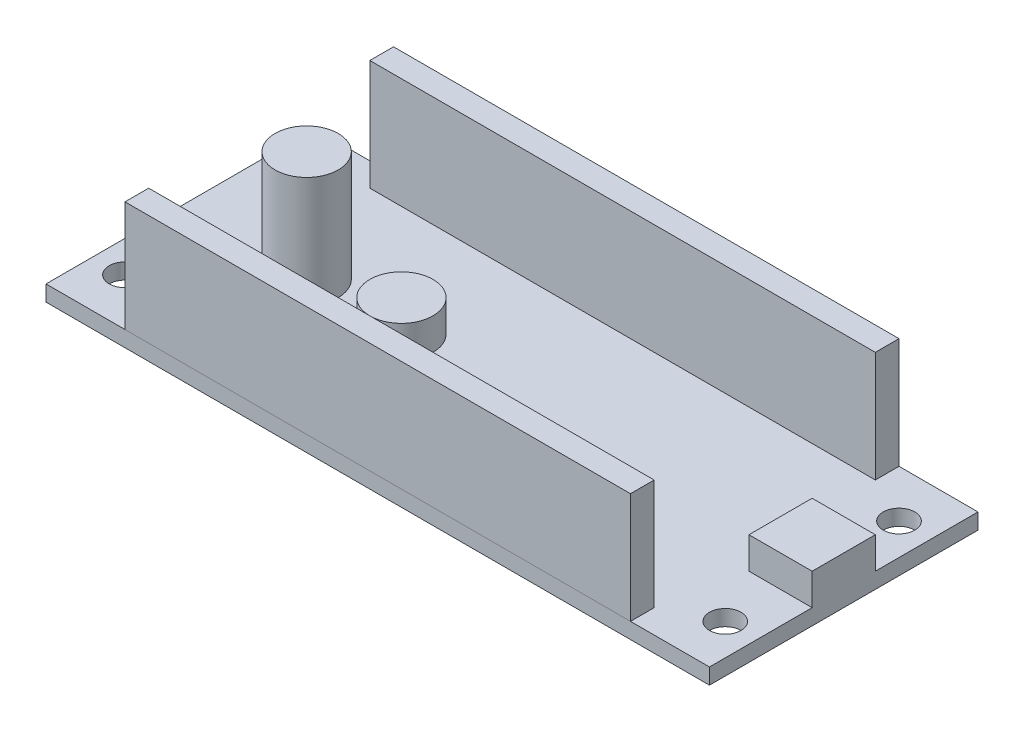
ISO-10303-21;
HEADER;
FILE_DESCRIPTION(('STEP AP214'),'2;1');
FILE_NAME('part.step','',(''),(''),'','','');
FILE_SCHEMA(('AUTOMOTIVE_DESIGN { 1 0 10303 214 1 1 1 1 }'));
ENDSEC;
DATA;
#1=APPLICATION_CONTEXT('core data for automotive mechanical design processes');
#2=APPLICATION_PROTOCOL_DEFINITION('international standard','automotive_design',2000,#1);
#3=PRODUCT_CONTEXT('',#1,'mechanical');
#4=PRODUCT('Part','Part','',(#3));
#5=PRODUCT_RELATED_PRODUCT_CATEGORY('part','',(#4));
#6=PRODUCT_DEFINITION_FORMATION('','',#4);
#7=PRODUCT_DEFINITION_CONTEXT('part definition',#1,'design');
#8=PRODUCT_DEFINITION('design','',#6,#7);
#9=PRODUCT_DEFINITION_SHAPE('','',#8);
#10=(LENGTH_UNIT() NAMED_UNIT(*) SI_UNIT(.MILLI.,.METRE.));
#11=(NAMED_UNIT(*) PLANE_ANGLE_UNIT() SI_UNIT($,.RADIAN.));
#12=(NAMED_UNIT(*) SI_UNIT($,.STERADIAN.) SOLID_ANGLE_UNIT());
#13=UNCERTAINTY_MEASURE_WITH_UNIT(LENGTH_MEASURE(1.E-05),#10,'distance_accuracy_value','');
#14=(GEOMETRIC_REPRESENTATION_CONTEXT(3) GLOBAL_UNCERTAINTY_ASSIGNED_CONTEXT((#13)) GLOBAL_UNIT_ASSIGNED_CONTEXT((#10,
#11,#12)) REPRESENTATION_CONTEXT('',''));
#15=CARTESIAN_POINT('',(0.,0.,0.));
#16=DIRECTION('',(0.,0.,1.));
#17=DIRECTION('',(1.,0.,0.));
#18=AXIS2_PLACEMENT_3D('',#15,#16,#17);
#19=CARTESIAN_POINT('',(-20.6375,12.7,0.));
#20=DIRECTION('',(0.,-1.,0.));
#21=DIRECTION('',(0.,0.,-1.));
#22=AXIS2_PLACEMENT_3D('',#19,#20,#21);
#23=CYLINDRICAL_SURFACE('',#22,3.175);
#24=CARTESIAN_POINT('',(-20.6375,12.7,0.));
#25=DIRECTION('',(0.,1.,0.));
#26=DIRECTION('',(0.,0.,1.));
#27=AXIS2_PLACEMENT_3D('',#24,#25,#26);
#28=CIRCLE('',#27,3.175);
#29=CARTESIAN_POINT('',(-20.6375,12.7,3.175));
#30=VERTEX_POINT('',#29);
#31=EDGE_CURVE('E11',#30,#30,#28,.T.);
#32=ORIENTED_EDGE('',*,*,#31,.F.);
#33=EDGE_LOOP('',(#32));
#34=FACE_BOUND('',#33,.T.);
#35=CARTESIAN_POINT('',(-20.6375,1.5875,0.));
#36=DIRECTION('',(0.,1.,0.));
#37=DIRECTION('',(0.,0.,1.));
#38=AXIS2_PLACEMENT_3D('',#35,#36,#37);
#39=CIRCLE('',#38,3.175);
#40=CARTESIAN_POINT('',(-20.6375,1.5875,3.175));
#41=VERTEX_POINT('',#40);
#42=EDGE_CURVE('E46',#41,#41,#39,.T.);
#43=ORIENTED_EDGE('',*,*,#42,.T.);
#44=EDGE_LOOP('',(#43));
#45=FACE_BOUND('',#44,.T.);
#46=ADVANCED_FACE('F43',(#34,#45),#23,.T.);
#47=CARTESIAN_POINT('',(-20.6375,12.7,0.));
#48=DIRECTION('',(0.,1.,0.));
#49=DIRECTION('',(0.,0.,1.));
#50=AXIS2_PLACEMENT_3D('',#47,#48,#49);
#51=PLANE('',#50);
#52=ORIENTED_EDGE('',*,*,#31,.T.);
#53=EDGE_LOOP('',(#52));
#54=FACE_BOUND('',#53,.T.);
#55=ADVANCED_FACE('F58',(#54),#51,.T.);
#56=CARTESIAN_POINT('',(-20.6375,1.5875,0.));
#57=DIRECTION('',(0.,1.,0.));
#58=DIRECTION('',(0.,0.,1.));
#59=AXIS2_PLACEMENT_3D('',#56,#57,#58);
#60=PLANE('',#59);
#61=ORIENTED_EDGE('',*,*,#42,.F.);
#62=EDGE_LOOP('',(#61));
#63=FACE_BOUND('',#62,.T.);
#64=ADVANCED_FACE('F56',(#63),#60,.F.);
#65=CLOSED_SHELL('',(#46,#55,#64));
#66=MANIFOLD_SOLID_BREP('B2',#65);
#67=CARTESIAN_POINT('',(-25.4,12.7,13.49375));
#68=DIRECTION('',(1.,0.,0.));
#69=DIRECTION('',(0.,0.,-1.));
#70=AXIS2_PLACEMENT_3D('',#67,#68,#69);
#71=PLANE('',#70);
#72=DIRECTION('',(0.,0.,1.));
#73=VECTOR('',#72,1.);
#74=CARTESIAN_POINT('',(-25.4,1.5875,13.49375));
#75=LINE('',#74,#73);
#76=CARTESIAN_POINT('',(-25.4,1.5875,11.1125));
#77=VERTEX_POINT('',#76);
#78=CARTESIAN_POINT('',(-25.4,1.5875,13.49375));
#79=VERTEX_POINT('',#78);
#80=EDGE_CURVE('E156',#77,#79,#75,.T.);
#81=ORIENTED_EDGE('',*,*,#80,.T.);
#82=DIRECTION('',(0.,-1.,0.));
#83=VECTOR('',#82,1.);
#84=CARTESIAN_POINT('',(-25.4,12.7,13.49375));
#85=LINE('',#84,#83);
#86=CARTESIAN_POINT('',(-25.4,12.7,13.49375));
#87=VERTEX_POINT('',#86);
#88=EDGE_CURVE('E41',#87,#79,#85,.T.);
#89=ORIENTED_EDGE('',*,*,#88,.F.);
#90=DIRECTION('',(0.,0.,1.));
#91=VECTOR('',#90,1.);
#92=CARTESIAN_POINT('',(-25.4,12.7,13.49375));
#93=LINE('',#92,#91);
#94=CARTESIAN_POINT('',(-25.4,12.7,11.1125));
#95=VERTEX_POINT('',#94);
#96=EDGE_CURVE('E144',#95,#87,#93,.T.);
#97=ORIENTED_EDGE('',*,*,#96,.F.);
#98=DIRECTION('',(0.,-1.,0.));
#99=VECTOR('',#98,1.);
#100=CARTESIAN_POINT('',(-25.4,12.7,11.1125));
#101=LINE('',#100,#99);
#102=EDGE_CURVE('E152',#95,#77,#101,.T.);
#103=ORIENTED_EDGE('',*,*,#102,.T.);
#104=EDGE_LOOP('',(#81,#89,#97,#103));
#105=FACE_BOUND('',#104,.T.);
#106=ADVANCED_FACE('F93',(#105),#71,.F.);
#107=CARTESIAN_POINT('',(-25.4,12.7,13.49375));
#108=DIRECTION('',(0.,0.,-1.));
#109=DIRECTION('',(-1.,0.,0.));
#110=AXIS2_PLACEMENT_3D('',#107,#108,#109);
#111=PLANE('',#110);
#112=DIRECTION('',(1.,0.,0.));
#113=VECTOR('',#112,1.);
#114=CARTESIAN_POINT('',(-25.4,1.5875,13.49375));
#115=LINE('',#114,#113);
#116=CARTESIAN_POINT('',(25.4,1.5875,13.49375));
#117=VERTEX_POINT('',#116);
#118=EDGE_CURVE('E148',#79,#117,#115,.T.);
#119=ORIENTED_EDGE('',*,*,#118,.T.);
#120=DIRECTION('',(0.,-1.,0.));
#121=VECTOR('',#120,1.);
#122=CARTESIAN_POINT('',(25.4,12.7,13.49375));
#123=LINE('',#122,#121);
#124=CARTESIAN_POINT('',(25.4,12.7,13.49375));
#125=VERTEX_POINT('',#124);
#126=EDGE_CURVE('E101',#125,#117,#123,.T.);
#127=ORIENTED_EDGE('',*,*,#126,.F.);
#128=DIRECTION('',(1.,0.,0.));
#129=VECTOR('',#128,1.);
#130=CARTESIAN_POINT('',(-25.4,12.7,13.49375));
#131=LINE('',#130,#129);
#132=EDGE_CURVE('E139',#87,#125,#131,.T.);
#133=ORIENTED_EDGE('',*,*,#132,.F.);
#134=ORIENTED_EDGE('',*,*,#88,.T.);
#135=EDGE_LOOP('',(#119,#127,#133,#134));
#136=FACE_BOUND('',#135,.T.);
#137=ADVANCED_FACE('F147',(#136),#111,.F.);
#138=CARTESIAN_POINT('',(25.4,12.7,13.49375));
#139=DIRECTION('',(-1.,0.,0.));
#140=DIRECTION('',(0.,0.,1.));
#141=AXIS2_PLACEMENT_3D('',#138,#139,#140);
#142=PLANE('',#141);
#143=DIRECTION('',(0.,0.,-1.));
#144=VECTOR('',#143,1.);
#145=CARTESIAN_POINT('',(25.4,1.5875,13.49375));
#146=LINE('',#145,#144);
#147=CARTESIAN_POINT('',(25.4,1.5875,11.1125));
#148=VERTEX_POINT('',#147);
#149=EDGE_CURVE('E126',#117,#148,#146,.T.);
#150=ORIENTED_EDGE('',*,*,#149,.T.);
#151=DIRECTION('',(0.,-1.,0.));
#152=VECTOR('',#151,1.);
#153=CARTESIAN_POINT('',(25.4,12.7,11.1125));
#154=LINE('',#153,#152);
#155=CARTESIAN_POINT('',(25.4,12.7,11.1125));
#156=VERTEX_POINT('',#155);
#157=EDGE_CURVE('E149',#156,#148,#154,.T.);
#158=ORIENTED_EDGE('',*,*,#157,.F.);
#159=DIRECTION('',(0.,0.,-1.));
#160=VECTOR('',#159,1.);
#161=CARTESIAN_POINT('',(25.4,12.7,13.49375));
#162=LINE('',#161,#160);
#163=EDGE_CURVE('E142',#125,#156,#162,.T.);
#164=ORIENTED_EDGE('',*,*,#163,.F.);
#165=ORIENTED_EDGE('',*,*,#126,.T.);
#166=EDGE_LOOP('',(#150,#158,#164,#165));
#167=FACE_BOUND('',#166,.T.);
#168=ADVANCED_FACE('F150',(#167),#142,.F.);
#169=CARTESIAN_POINT('',(-25.4,12.7,11.1125));
#170=DIRECTION('',(0.,0.,1.));
#171=DIRECTION('',(1.,0.,0.));
#172=AXIS2_PLACEMENT_3D('',#169,#170,#171);
#173=PLANE('',#172);
#174=DIRECTION('',(-1.,0.,0.));
#175=VECTOR('',#174,1.);
#176=CARTESIAN_POINT('',(-25.4,1.5875,11.1125));
#177=LINE('',#176,#175);
#178=EDGE_CURVE('E132',#148,#77,#177,.T.);
#179=ORIENTED_EDGE('',*,*,#178,.T.);
#180=ORIENTED_EDGE('',*,*,#102,.F.);
#181=DIRECTION('',(-1.,0.,0.));
#182=VECTOR('',#181,1.);
#183=CARTESIAN_POINT('',(-25.4,12.7,11.1125));
#184=LINE('',#183,#182);
#185=EDGE_CURVE('E109',#156,#95,#184,.T.);
#186=ORIENTED_EDGE('',*,*,#185,.F.);
#187=ORIENTED_EDGE('',*,*,#157,.T.);
#188=EDGE_LOOP('',(#179,#180,#186,#187));
#189=FACE_BOUND('',#188,.T.);
#190=ADVANCED_FACE('F163',(#189),#173,.F.);
#191=CARTESIAN_POINT('',(0.,12.7,0.));
#192=DIRECTION('',(0.,-1.,0.));
#193=DIRECTION('',(0.,0.,-1.));
#194=AXIS2_PLACEMENT_3D('',#191,#192,#193);
#195=PLANE('',#194);
#196=ORIENTED_EDGE('',*,*,#96,.T.);
#197=ORIENTED_EDGE('',*,*,#132,.T.);
#198=ORIENTED_EDGE('',*,*,#163,.T.);
#199=ORIENTED_EDGE('',*,*,#185,.T.);
#200=EDGE_LOOP('',(#196,#197,#198,#199));
#201=FACE_BOUND('',#200,.T.);
#202=ADVANCED_FACE('F140',(#201),#195,.F.);
#203=CARTESIAN_POINT('',(0.,1.5875,0.));
#204=DIRECTION('',(0.,-1.,0.));
#205=DIRECTION('',(0.,0.,-1.));
#206=AXIS2_PLACEMENT_3D('',#203,#204,#205);
#207=PLANE('',#206);
#208=ORIENTED_EDGE('',*,*,#80,.F.);
#209=ORIENTED_EDGE('',*,*,#178,.F.);
#210=ORIENTED_EDGE('',*,*,#149,.F.);
#211=ORIENTED_EDGE('',*,*,#118,.F.);
#212=EDGE_LOOP('',(#208,#209,#210,#211));
#213=FACE_BOUND('',#212,.T.);
#214=ADVANCED_FACE('F166',(#213),#207,.T.);
#215=CLOSED_SHELL('',(#106,#137,#168,#190,#202,#214));
#216=MANIFOLD_SOLID_BREP('B6',#215);
#217=CARTESIAN_POINT('',(-25.4,12.7,-13.49375));
#218=DIRECTION('',(1.,0.,0.));
#219=DIRECTION('',(0.,0.,-1.));
#220=AXIS2_PLACEMENT_3D('',#217,#218,#219);
#221=PLANE('',#220);
#222=DIRECTION('',(0.,0.,1.));
#223=VECTOR('',#222,1.);
#224=CARTESIAN_POINT('',(-25.4,1.5875,-13.49375));
#225=LINE('',#224,#223);
#226=CARTESIAN_POINT('',(-25.4,1.5875,-13.49375));
#227=VERTEX_POINT('',#226);
#228=CARTESIAN_POINT('',(-25.4,1.5875,-11.1125));
#229=VERTEX_POINT('',#228);
#230=EDGE_CURVE('E288',#227,#229,#225,.T.);
#231=ORIENTED_EDGE('',*,*,#230,.T.);
#232=DIRECTION('',(0.,-1.,0.));
#233=VECTOR('',#232,1.);
#234=CARTESIAN_POINT('',(-25.4,12.7,-11.1125));
#235=LINE('',#234,#233);
#236=CARTESIAN_POINT('',(-25.4,12.7,-11.1125));
#237=VERTEX_POINT('',#236);
#238=EDGE_CURVE('E91',#237,#229,#235,.T.);
#239=ORIENTED_EDGE('',*,*,#238,.F.);
#240=DIRECTION('',(0.,0.,1.));
#241=VECTOR('',#240,1.);
#242=CARTESIAN_POINT('',(-25.4,12.7,-13.49375));
#243=LINE('',#242,#241);
#244=CARTESIAN_POINT('',(-25.4,12.7,-13.49375));
#245=VERTEX_POINT('',#244);
#246=EDGE_CURVE('E276',#245,#237,#243,.T.);
#247=ORIENTED_EDGE('',*,*,#246,.F.);
#248=DIRECTION('',(0.,-1.,0.));
#249=VECTOR('',#248,1.);
#250=CARTESIAN_POINT('',(-25.4,12.7,-13.49375));
#251=LINE('',#250,#249);
#252=EDGE_CURVE('E284',#245,#227,#251,.T.);
#253=ORIENTED_EDGE('',*,*,#252,.T.);
#254=EDGE_LOOP('',(#231,#239,#247,#253));
#255=FACE_BOUND('',#254,.T.);
#256=ADVANCED_FACE('F225',(#255),#221,.F.);
#257=CARTESIAN_POINT('',(-25.4,12.7,-11.1125));
#258=DIRECTION('',(0.,0.,-1.));
#259=DIRECTION('',(-1.,0.,0.));
#260=AXIS2_PLACEMENT_3D('',#257,#258,#259);
#261=PLANE('',#260);
#262=DIRECTION('',(1.,0.,0.));
#263=VECTOR('',#262,1.);
#264=CARTESIAN_POINT('',(-25.4,1.5875,-11.1125));
#265=LINE('',#264,#263);
#266=CARTESIAN_POINT('',(25.4,1.5875,-11.1125));
#267=VERTEX_POINT('',#266);
#268=EDGE_CURVE('E280',#229,#267,#265,.T.);
#269=ORIENTED_EDGE('',*,*,#268,.T.);
#270=DIRECTION('',(0.,-1.,0.));
#271=VECTOR('',#270,1.);
#272=CARTESIAN_POINT('',(25.4,12.7,-11.1125));
#273=LINE('',#272,#271);
#274=CARTESIAN_POINT('',(25.4,12.7,-11.1125));
#275=VERTEX_POINT('',#274);
#276=EDGE_CURVE('E233',#275,#267,#273,.T.);
#277=ORIENTED_EDGE('',*,*,#276,.F.);
#278=DIRECTION('',(1.,0.,0.));
#279=VECTOR('',#278,1.);
#280=CARTESIAN_POINT('',(-25.4,12.7,-11.1125));
#281=LINE('',#280,#279);
#282=EDGE_CURVE('E271',#237,#275,#281,.T.);
#283=ORIENTED_EDGE('',*,*,#282,.F.);
#284=ORIENTED_EDGE('',*,*,#238,.T.);
#285=EDGE_LOOP('',(#269,#277,#283,#284));
#286=FACE_BOUND('',#285,.T.);
#287=ADVANCED_FACE('F279',(#286),#261,.F.);
#288=CARTESIAN_POINT('',(25.4,12.7,-13.49375));
#289=DIRECTION('',(-1.,0.,0.));
#290=DIRECTION('',(0.,0.,1.));
#291=AXIS2_PLACEMENT_3D('',#288,#289,#290);
#292=PLANE('',#291);
#293=DIRECTION('',(0.,0.,-1.));
#294=VECTOR('',#293,1.);
#295=CARTESIAN_POINT('',(25.4,1.5875,-13.49375));
#296=LINE('',#295,#294);
#297=CARTESIAN_POINT('',(25.4,1.5875,-13.49375));
#298=VERTEX_POINT('',#297);
#299=EDGE_CURVE('E258',#267,#298,#296,.T.);
#300=ORIENTED_EDGE('',*,*,#299,.T.);
#301=DIRECTION('',(0.,-1.,0.));
#302=VECTOR('',#301,1.);
#303=CARTESIAN_POINT('',(25.4,12.7,-13.49375));
#304=LINE('',#303,#302);
#305=CARTESIAN_POINT('',(25.4,12.7,-13.49375));
#306=VERTEX_POINT('',#305);
#307=EDGE_CURVE('E281',#306,#298,#304,.T.);
#308=ORIENTED_EDGE('',*,*,#307,.F.);
#309=DIRECTION('',(0.,0.,-1.));
#310=VECTOR('',#309,1.);
#311=CARTESIAN_POINT('',(25.4,12.7,-13.49375));
#312=LINE('',#311,#310);
#313=EDGE_CURVE('E274',#275,#306,#312,.T.);
#314=ORIENTED_EDGE('',*,*,#313,.F.);
#315=ORIENTED_EDGE('',*,*,#276,.T.);
#316=EDGE_LOOP('',(#300,#308,#314,#315));
#317=FACE_BOUND('',#316,.T.);
#318=ADVANCED_FACE('F282',(#317),#292,.F.);
#319=CARTESIAN_POINT('',(-25.4,12.7,-13.49375));
#320=DIRECTION('',(0.,0.,1.));
#321=DIRECTION('',(1.,0.,0.));
#322=AXIS2_PLACEMENT_3D('',#319,#320,#321);
#323=PLANE('',#322);
#324=DIRECTION('',(-1.,0.,0.));
#325=VECTOR('',#324,1.);
#326=CARTESIAN_POINT('',(-25.4,1.5875,-13.49375));
#327=LINE('',#326,#325);
#328=EDGE_CURVE('E264',#298,#227,#327,.T.);
#329=ORIENTED_EDGE('',*,*,#328,.T.);
#330=ORIENTED_EDGE('',*,*,#252,.F.);
#331=DIRECTION('',(-1.,0.,0.));
#332=VECTOR('',#331,1.);
#333=CARTESIAN_POINT('',(-25.4,12.7,-13.49375));
#334=LINE('',#333,#332);
#335=EDGE_CURVE('E241',#306,#245,#334,.T.);
#336=ORIENTED_EDGE('',*,*,#335,.F.);
#337=ORIENTED_EDGE('',*,*,#307,.T.);
#338=EDGE_LOOP('',(#329,#330,#336,#337));
#339=FACE_BOUND('',#338,.T.);
#340=ADVANCED_FACE('F295',(#339),#323,.F.);
#341=CARTESIAN_POINT('',(0.,12.7,0.));
#342=DIRECTION('',(0.,1.,0.));
#343=DIRECTION('',(0.,0.,1.));
#344=AXIS2_PLACEMENT_3D('',#341,#342,#343);
#345=PLANE('',#344);
#346=ORIENTED_EDGE('',*,*,#246,.T.);
#347=ORIENTED_EDGE('',*,*,#282,.T.);
#348=ORIENTED_EDGE('',*,*,#313,.T.);
#349=ORIENTED_EDGE('',*,*,#335,.T.);
#350=EDGE_LOOP('',(#346,#347,#348,#349));
#351=FACE_BOUND('',#350,.T.);
#352=ADVANCED_FACE('F272',(#351),#345,.T.);
#353=CARTESIAN_POINT('',(0.,1.5875,0.));
#354=DIRECTION('',(0.,1.,0.));
#355=DIRECTION('',(0.,0.,1.));
#356=AXIS2_PLACEMENT_3D('',#353,#354,#355);
#357=PLANE('',#356);
#358=ORIENTED_EDGE('',*,*,#230,.F.);
#359=ORIENTED_EDGE('',*,*,#328,.F.);
#360=ORIENTED_EDGE('',*,*,#299,.F.);
#361=ORIENTED_EDGE('',*,*,#268,.F.);
#362=EDGE_LOOP('',(#358,#359,#360,#361));
#363=FACE_BOUND('',#362,.T.);
#364=ADVANCED_FACE('F298',(#363),#357,.F.);
#365=CLOSED_SHELL('',(#256,#287,#318,#340,#352,#364));
#366=MANIFOLD_SOLID_BREP('B35',#365);
#367=CARTESIAN_POINT('',(33.3375,1.5875,-13.49375));
#368=DIRECTION('',(-1.,0.,0.));
#369=DIRECTION('',(0.,0.,1.));
#370=AXIS2_PLACEMENT_3D('',#367,#368,#369);
#371=PLANE('',#370);
#372=DIRECTION('',(0.,0.,-1.));
#373=VECTOR('',#372,1.);
#374=CARTESIAN_POINT('',(33.3375,0.,-13.49375));
#375=LINE('',#374,#373);
#376=CARTESIAN_POINT('',(33.3375,0.,13.49375));
#377=VERTEX_POINT('',#376);
#378=CARTESIAN_POINT('',(33.3375,0.,-13.49375));
#379=VERTEX_POINT('',#378);
#380=EDGE_CURVE('E434',#377,#379,#375,.T.);
#381=ORIENTED_EDGE('',*,*,#380,.T.);
#382=DIRECTION('',(0.,-1.,0.));
#383=VECTOR('',#382,1.);
#384=CARTESIAN_POINT('',(33.3375,1.5875,-13.49375));
#385=LINE('',#384,#383);
#386=CARTESIAN_POINT('',(33.3375,1.5875,-13.49375));
#387=VERTEX_POINT('',#386);
#388=EDGE_CURVE('E223',#387,#379,#385,.T.);
#389=ORIENTED_EDGE('',*,*,#388,.F.);
#390=DIRECTION('',(0.,0.,-1.));
#391=VECTOR('',#390,1.);
#392=CARTESIAN_POINT('',(33.3375,1.5875,-13.49375));
#393=LINE('',#392,#391);
#394=CARTESIAN_POINT('',(33.3375,1.5875,-3.175));
#395=VERTEX_POINT('',#394);
#396=EDGE_CURVE('E433',#395,#387,#393,.T.);
#397=ORIENTED_EDGE('',*,*,#396,.F.);
#398=DIRECTION('',(0.,-1.,0.));
#399=VECTOR('',#398,1.);
#400=CARTESIAN_POINT('',(33.3375,4.7625,-3.175));
#401=LINE('',#400,#399);
#402=CARTESIAN_POINT('',(33.3375,4.7625,-3.175));
#403=VERTEX_POINT('',#402);
#404=EDGE_CURVE('E415',#403,#395,#401,.T.);
#405=ORIENTED_EDGE('',*,*,#404,.F.);
#406=DIRECTION('',(0.,0.,-1.));
#407=VECTOR('',#406,1.);
#408=CARTESIAN_POINT('',(33.3375,4.7625,-3.175));
#409=LINE('',#408,#407);
#410=CARTESIAN_POINT('',(33.3375,4.7625,3.175));
#411=VERTEX_POINT('',#410);
#412=EDGE_CURVE('E421',#411,#403,#409,.T.);
#413=ORIENTED_EDGE('',*,*,#412,.F.);
#414=DIRECTION('',(0.,-1.,0.));
#415=VECTOR('',#414,1.);
#416=CARTESIAN_POINT('',(33.3375,4.7625,3.175));
#417=LINE('',#416,#415);
#418=CARTESIAN_POINT('',(33.3375,1.5875,3.175));
#419=VERTEX_POINT('',#418);
#420=EDGE_CURVE('E478',#411,#419,#417,.T.);
#421=ORIENTED_EDGE('',*,*,#420,.T.);
#422=CARTESIAN_POINT('',(33.3375,1.5875,13.49375));
#423=VERTEX_POINT('',#422);
#424=EDGE_CURVE('E442',#423,#419,#393,.T.);
#425=ORIENTED_EDGE('',*,*,#424,.F.);
#426=DIRECTION('',(0.,-1.,0.));
#427=VECTOR('',#426,1.);
#428=CARTESIAN_POINT('',(33.3375,1.5875,13.49375));
#429=LINE('',#428,#427);
#430=EDGE_CURVE('E449',#423,#377,#429,.T.);
#431=ORIENTED_EDGE('',*,*,#430,.T.);
#432=EDGE_LOOP('',(#381,#389,#397,#405,#413,#421,#425,#431));
#433=FACE_BOUND('',#432,.T.);
#434=ADVANCED_FACE('F348',(#433),#371,.F.);
#435=CARTESIAN_POINT('',(-33.3375,1.5875,-13.49375));
#436=DIRECTION('',(0.,0.,1.));
#437=DIRECTION('',(1.,0.,0.));
#438=AXIS2_PLACEMENT_3D('',#435,#436,#437);
#439=PLANE('',#438);
#440=DIRECTION('',(-1.,0.,0.));
#441=VECTOR('',#440,1.);
#442=CARTESIAN_POINT('',(-33.3375,0.,-13.49375));
#443=LINE('',#442,#441);
#444=CARTESIAN_POINT('',(-33.3375,0.,-13.49375));
#445=VERTEX_POINT('',#444);
#446=EDGE_CURVE('E436',#379,#445,#443,.T.);
#447=ORIENTED_EDGE('',*,*,#446,.T.);
#448=DIRECTION('',(0.,-1.,0.));
#449=VECTOR('',#448,1.);
#450=CARTESIAN_POINT('',(-33.3375,1.5875,-13.49375));
#451=LINE('',#450,#449);
#452=CARTESIAN_POINT('',(-33.3375,1.5875,-13.49375));
#453=VERTEX_POINT('',#452);
#454=EDGE_CURVE('E355',#453,#445,#451,.T.);
#455=ORIENTED_EDGE('',*,*,#454,.F.);
#456=DIRECTION('',(-1.,0.,0.));
#457=VECTOR('',#456,1.);
#458=CARTESIAN_POINT('',(-33.3375,1.5875,-13.49375));
#459=LINE('',#458,#457);
#460=EDGE_CURVE('E444',#387,#453,#459,.T.);
#461=ORIENTED_EDGE('',*,*,#460,.F.);
#462=ORIENTED_EDGE('',*,*,#388,.T.);
#463=EDGE_LOOP('',(#447,#455,#461,#462));
#464=FACE_BOUND('',#463,.T.);
#465=ADVANCED_FACE('F555',(#464),#439,.F.);
#466=CARTESIAN_POINT('',(-33.3375,1.5875,-13.49375));
#467=DIRECTION('',(1.,0.,0.));
#468=DIRECTION('',(0.,0.,-1.));
#469=AXIS2_PLACEMENT_3D('',#466,#467,#468);
#470=PLANE('',#469);
#471=DIRECTION('',(0.,0.,1.));
#472=VECTOR('',#471,1.);
#473=CARTESIAN_POINT('',(-33.3375,0.,-13.49375));
#474=LINE('',#473,#472);
#475=CARTESIAN_POINT('',(-33.3375,0.,13.49375));
#476=VERTEX_POINT('',#475);
#477=EDGE_CURVE('E452',#445,#476,#474,.T.);
#478=ORIENTED_EDGE('',*,*,#477,.T.);
#479=DIRECTION('',(0.,-1.,0.));
#480=VECTOR('',#479,1.);
#481=CARTESIAN_POINT('',(-33.3375,1.5875,13.49375));
#482=LINE('',#481,#480);
#483=CARTESIAN_POINT('',(-33.3375,1.5875,13.49375));
#484=VERTEX_POINT('',#483);
#485=EDGE_CURVE('E458',#484,#476,#482,.T.);
#486=ORIENTED_EDGE('',*,*,#485,.F.);
#487=DIRECTION('',(0.,0.,1.));
#488=VECTOR('',#487,1.);
#489=CARTESIAN_POINT('',(-33.3375,1.5875,-13.49375));
#490=LINE('',#489,#488);
#491=EDGE_CURVE('E446',#453,#484,#490,.T.);
#492=ORIENTED_EDGE('',*,*,#491,.F.);
#493=ORIENTED_EDGE('',*,*,#454,.T.);
#494=EDGE_LOOP('',(#478,#486,#492,#493));
#495=FACE_BOUND('',#494,.T.);
#496=ADVANCED_FACE('F465',(#495),#470,.F.);
#497=CARTESIAN_POINT('',(-33.3375,1.5875,13.49375));
#498=DIRECTION('',(0.,0.,-1.));
#499=DIRECTION('',(-1.,0.,0.));
#500=AXIS2_PLACEMENT_3D('',#497,#498,#499);
#501=PLANE('',#500);
#502=DIRECTION('',(1.,0.,0.));
#503=VECTOR('',#502,1.);
#504=CARTESIAN_POINT('',(-33.3375,0.,13.49375));
#505=LINE('',#504,#503);
#506=EDGE_CURVE('E454',#476,#377,#505,.T.);
#507=ORIENTED_EDGE('',*,*,#506,.T.);
#508=ORIENTED_EDGE('',*,*,#430,.F.);
#509=DIRECTION('',(1.,0.,0.));
#510=VECTOR('',#509,1.);
#511=CARTESIAN_POINT('',(-33.3375,1.5875,13.49375));
#512=LINE('',#511,#510);
#513=EDGE_CURVE('E448',#484,#423,#512,.T.);
#514=ORIENTED_EDGE('',*,*,#513,.F.);
#515=ORIENTED_EDGE('',*,*,#485,.T.);
#516=EDGE_LOOP('',(#507,#508,#514,#515));
#517=FACE_BOUND('',#516,.T.);
#518=ADVANCED_FACE('F475',(#517),#501,.F.);
#519=CARTESIAN_POINT('',(0.,1.5875,0.));
#520=DIRECTION('',(0.,1.,0.));
#521=DIRECTION('',(0.,0.,1.));
#522=AXIS2_PLACEMENT_3D('',#519,#520,#521);
#523=PLANE('',#522);
#524=CARTESIAN_POINT('',(-30.1625,1.5875,8.73125));
#525=DIRECTION('',(0.,1.,0.));
#526=DIRECTION('',(0.,0.,1.));
#527=AXIS2_PLACEMENT_3D('',#524,#525,#526);
#528=CIRCLE('',#527,1.5875);
#529=CARTESIAN_POINT('',(-30.1625,1.5875,10.31875));
#530=VERTEX_POINT('',#529);
#531=EDGE_CURVE('E507',#530,#530,#528,.T.);
#532=ORIENTED_EDGE('',*,*,#531,.F.);
#533=EDGE_LOOP('',(#532));
#534=FACE_BOUND('',#533,.T.);
#535=CARTESIAN_POINT('',(-30.1625,1.5875,-8.73125));
#536=DIRECTION('',(0.,1.,0.));
#537=DIRECTION('',(0.,0.,1.));
#538=AXIS2_PLACEMENT_3D('',#535,#536,#537);
#539=CIRCLE('',#538,1.5875);
#540=CARTESIAN_POINT('',(-30.1625,1.5875,-7.14375));
#541=VERTEX_POINT('',#540);
#542=EDGE_CURVE('E513',#541,#541,#539,.T.);
#543=ORIENTED_EDGE('',*,*,#542,.F.);
#544=EDGE_LOOP('',(#543));
#545=FACE_BOUND('',#544,.T.);
#546=CARTESIAN_POINT('',(30.1625,1.5875,-8.73125));
#547=DIRECTION('',(0.,1.,0.));
#548=DIRECTION('',(0.,0.,1.));
#549=AXIS2_PLACEMENT_3D('',#546,#547,#548);
#550=CIRCLE('',#549,1.5875);
#551=CARTESIAN_POINT('',(30.1625,1.5875,-7.14375));
#552=VERTEX_POINT('',#551);
#553=EDGE_CURVE('E519',#552,#552,#550,.T.);
#554=ORIENTED_EDGE('',*,*,#553,.F.);
#555=EDGE_LOOP('',(#554));
#556=FACE_BOUND('',#555,.T.);
#557=CARTESIAN_POINT('',(30.1625,1.5875,8.73125));
#558=DIRECTION('',(0.,1.,0.));
#559=DIRECTION('',(0.,0.,1.));
#560=AXIS2_PLACEMENT_3D('',#557,#558,#559);
#561=CIRCLE('',#560,1.5875);
#562=CARTESIAN_POINT('',(30.1625,1.5875,10.31875));
#563=VERTEX_POINT('',#562);
#564=EDGE_CURVE('E501',#563,#563,#561,.T.);
#565=ORIENTED_EDGE('',*,*,#564,.F.);
#566=EDGE_LOOP('',(#565));
#567=FACE_BOUND('',#566,.T.);
#568=CARTESIAN_POINT('',(-11.1125,1.5875,0.));
#569=DIRECTION('',(0.,1.,0.));
#570=DIRECTION('',(0.,0.,1.));
#571=AXIS2_PLACEMENT_3D('',#568,#569,#570);
#572=CIRCLE('',#571,3.175);
#573=CARTESIAN_POINT('',(-11.1125,1.5875,3.175));
#574=VERTEX_POINT('',#573);
#575=EDGE_CURVE('E493',#574,#574,#572,.T.);
#576=ORIENTED_EDGE('',*,*,#575,.F.);
#577=EDGE_LOOP('',(#576));
#578=FACE_BOUND('',#577,.T.);
#579=DIRECTION('',(1.,0.,0.));
#580=VECTOR('',#579,1.);
#581=CARTESIAN_POINT('',(33.3375,1.5875,3.175));
#582=LINE('',#581,#580);
#583=CARTESIAN_POINT('',(26.9875,1.5875,3.175));
#584=VERTEX_POINT('',#583);
#585=EDGE_CURVE('E362',#584,#419,#582,.T.);
#586=ORIENTED_EDGE('',*,*,#585,.F.);
#587=DIRECTION('',(0.,0.,1.));
#588=VECTOR('',#587,1.);
#589=CARTESIAN_POINT('',(26.9875,1.5875,-3.175));
#590=LINE('',#589,#588);
#591=CARTESIAN_POINT('',(26.9875,1.5875,-3.175));
#592=VERTEX_POINT('',#591);
#593=EDGE_CURVE('E484',#592,#584,#590,.T.);
#594=ORIENTED_EDGE('',*,*,#593,.F.);
#595=DIRECTION('',(-1.,0.,0.));
#596=VECTOR('',#595,1.);
#597=CARTESIAN_POINT('',(33.3375,1.5875,-3.175));
#598=LINE('',#597,#596);
#599=EDGE_CURVE('E368',#395,#592,#598,.T.);
#600=ORIENTED_EDGE('',*,*,#599,.F.);
#601=ORIENTED_EDGE('',*,*,#396,.T.);
#602=ORIENTED_EDGE('',*,*,#460,.T.);
#603=ORIENTED_EDGE('',*,*,#491,.T.);
#604=ORIENTED_EDGE('',*,*,#513,.T.);
#605=ORIENTED_EDGE('',*,*,#424,.T.);
#606=EDGE_LOOP('',(#586,#594,#600,#601,#602,#603,#604,#605));
#607=FACE_BOUND('',#606,.T.);
#608=ADVANCED_FACE('F479',(#534,#545,#556,#567,#578,#607),#523,.T.);
#609=CARTESIAN_POINT('',(0.,0.,0.));
#610=DIRECTION('',(0.,1.,0.));
#611=DIRECTION('',(0.,0.,1.));
#612=AXIS2_PLACEMENT_3D('',#609,#610,#611);
#613=PLANE('',#612);
#614=CARTESIAN_POINT('',(-30.1625,0.,8.73125));
#615=DIRECTION('',(0.,1.,0.));
#616=DIRECTION('',(0.,0.,1.));
#617=AXIS2_PLACEMENT_3D('',#614,#615,#616);
#618=CIRCLE('',#617,1.5875);
#619=CARTESIAN_POINT('',(-30.1625,0.,10.31875));
#620=VERTEX_POINT('',#619);
#621=EDGE_CURVE('E510',#620,#620,#618,.T.);
#622=ORIENTED_EDGE('',*,*,#621,.T.);
#623=EDGE_LOOP('',(#622));
#624=FACE_BOUND('',#623,.T.);
#625=CARTESIAN_POINT('',(-30.1625,0.,-8.73125));
#626=DIRECTION('',(0.,1.,0.));
#627=DIRECTION('',(0.,0.,1.));
#628=AXIS2_PLACEMENT_3D('',#625,#626,#627);
#629=CIRCLE('',#628,1.5875);
#630=CARTESIAN_POINT('',(-30.1625,0.,-7.14375));
#631=VERTEX_POINT('',#630);
#632=EDGE_CURVE('E516',#631,#631,#629,.T.);
#633=ORIENTED_EDGE('',*,*,#632,.T.);
#634=EDGE_LOOP('',(#633));
#635=FACE_BOUND('',#634,.T.);
#636=CARTESIAN_POINT('',(30.1625,0.,-8.73125));
#637=DIRECTION('',(0.,1.,0.));
#638=DIRECTION('',(0.,0.,1.));
#639=AXIS2_PLACEMENT_3D('',#636,#637,#638);
#640=CIRCLE('',#639,1.5875);
#641=CARTESIAN_POINT('',(30.1625,0.,-7.14375));
#642=VERTEX_POINT('',#641);
#643=EDGE_CURVE('E504',#642,#642,#640,.T.);
#644=ORIENTED_EDGE('',*,*,#643,.T.);
#645=EDGE_LOOP('',(#644));
#646=FACE_BOUND('',#645,.T.);
#647=CARTESIAN_POINT('',(30.1625,0.,8.73125));
#648=DIRECTION('',(0.,1.,0.));
#649=DIRECTION('',(0.,0.,1.));
#650=AXIS2_PLACEMENT_3D('',#647,#648,#649);
#651=CIRCLE('',#650,1.5875);
#652=CARTESIAN_POINT('',(30.1625,0.,10.31875));
#653=VERTEX_POINT('',#652);
#654=EDGE_CURVE('E498',#653,#653,#651,.T.);
#655=ORIENTED_EDGE('',*,*,#654,.T.);
#656=EDGE_LOOP('',(#655));
#657=FACE_BOUND('',#656,.T.);
#658=ORIENTED_EDGE('',*,*,#380,.F.);
#659=ORIENTED_EDGE('',*,*,#506,.F.);
#660=ORIENTED_EDGE('',*,*,#477,.F.);
#661=ORIENTED_EDGE('',*,*,#446,.F.);
#662=EDGE_LOOP('',(#658,#659,#660,#661));
#663=FACE_BOUND('',#662,.T.);
#664=ADVANCED_FACE('F472',(#624,#635,#646,#657,#663),#613,.F.);
#665=CARTESIAN_POINT('',(33.3375,4.7625,-3.175));
#666=DIRECTION('',(0.,0.,1.));
#667=DIRECTION('',(1.,0.,0.));
#668=AXIS2_PLACEMENT_3D('',#665,#666,#667);
#669=PLANE('',#668);
#670=ORIENTED_EDGE('',*,*,#599,.T.);
#671=DIRECTION('',(0.,-1.,0.));
#672=VECTOR('',#671,1.);
#673=CARTESIAN_POINT('',(26.9875,4.7625,-3.175));
#674=LINE('',#673,#672);
#675=CARTESIAN_POINT('',(26.9875,4.7625,-3.175));
#676=VERTEX_POINT('',#675);
#677=EDGE_CURVE('E417',#676,#592,#674,.T.);
#678=ORIENTED_EDGE('',*,*,#677,.F.);
#679=DIRECTION('',(-1.,0.,0.));
#680=VECTOR('',#679,1.);
#681=CARTESIAN_POINT('',(33.3375,4.7625,-3.175));
#682=LINE('',#681,#680);
#683=EDGE_CURVE('E411',#403,#676,#682,.T.);
#684=ORIENTED_EDGE('',*,*,#683,.F.);
#685=ORIENTED_EDGE('',*,*,#404,.T.);
#686=EDGE_LOOP('',(#670,#678,#684,#685));
#687=FACE_BOUND('',#686,.T.);
#688=ADVANCED_FACE('F413',(#687),#669,.F.);
#689=CARTESIAN_POINT('',(26.9875,4.7625,-3.175));
#690=DIRECTION('',(1.,0.,0.));
#691=DIRECTION('',(0.,0.,-1.));
#692=AXIS2_PLACEMENT_3D('',#689,#690,#691);
#693=PLANE('',#692);
#694=ORIENTED_EDGE('',*,*,#593,.T.);
#695=DIRECTION('',(0.,-1.,0.));
#696=VECTOR('',#695,1.);
#697=CARTESIAN_POINT('',(26.9875,4.7625,3.175));
#698=LINE('',#697,#696);
#699=CARTESIAN_POINT('',(26.9875,4.7625,3.175));
#700=VERTEX_POINT('',#699);
#701=EDGE_CURVE('E438',#700,#584,#698,.T.);
#702=ORIENTED_EDGE('',*,*,#701,.F.);
#703=DIRECTION('',(0.,0.,1.));
#704=VECTOR('',#703,1.);
#705=CARTESIAN_POINT('',(26.9875,4.7625,-3.175));
#706=LINE('',#705,#704);
#707=EDGE_CURVE('E420',#676,#700,#706,.T.);
#708=ORIENTED_EDGE('',*,*,#707,.F.);
#709=ORIENTED_EDGE('',*,*,#677,.T.);
#710=EDGE_LOOP('',(#694,#702,#708,#709));
#711=FACE_BOUND('',#710,.T.);
#712=ADVANCED_FACE('F571',(#711),#693,.F.);
#713=CARTESIAN_POINT('',(33.3375,4.7625,3.175));
#714=DIRECTION('',(0.,0.,-1.));
#715=DIRECTION('',(-1.,0.,0.));
#716=AXIS2_PLACEMENT_3D('',#713,#714,#715);
#717=PLANE('',#716);
#718=ORIENTED_EDGE('',*,*,#585,.T.);
#719=ORIENTED_EDGE('',*,*,#420,.F.);
#720=DIRECTION('',(1.,0.,0.));
#721=VECTOR('',#720,1.);
#722=CARTESIAN_POINT('',(33.3375,4.7625,3.175));
#723=LINE('',#722,#721);
#724=EDGE_CURVE('E426',#700,#411,#723,.T.);
#725=ORIENTED_EDGE('',*,*,#724,.F.);
#726=ORIENTED_EDGE('',*,*,#701,.T.);
#727=EDGE_LOOP('',(#718,#719,#725,#726));
#728=FACE_BOUND('',#727,.T.);
#729=ADVANCED_FACE('F482',(#728),#717,.F.);
#730=CARTESIAN_POINT('',(0.,4.7625,0.));
#731=DIRECTION('',(0.,-1.,0.));
#732=DIRECTION('',(0.,0.,-1.));
#733=AXIS2_PLACEMENT_3D('',#730,#731,#732);
#734=PLANE('',#733);
#735=ORIENTED_EDGE('',*,*,#412,.T.);
#736=ORIENTED_EDGE('',*,*,#683,.T.);
#737=ORIENTED_EDGE('',*,*,#707,.T.);
#738=ORIENTED_EDGE('',*,*,#724,.T.);
#739=EDGE_LOOP('',(#735,#736,#737,#738));
#740=FACE_BOUND('',#739,.T.);
#741=ADVANCED_FACE('F424',(#740),#734,.F.);
#742=CARTESIAN_POINT('',(-11.1125,4.7625,0.));
#743=DIRECTION('',(0.,-1.,0.));
#744=DIRECTION('',(0.,0.,-1.));
#745=AXIS2_PLACEMENT_3D('',#742,#743,#744);
#746=CYLINDRICAL_SURFACE('',#745,3.175);
#747=CARTESIAN_POINT('',(-11.1125,4.7625,0.));
#748=DIRECTION('',(0.,1.,0.));
#749=DIRECTION('',(0.,0.,1.));
#750=AXIS2_PLACEMENT_3D('',#747,#748,#749);
#751=CIRCLE('',#750,3.175);
#752=CARTESIAN_POINT('',(-11.1125,4.7625,3.175));
#753=VERTEX_POINT('',#752);
#754=EDGE_CURVE('E491',#753,#753,#751,.T.);
#755=ORIENTED_EDGE('',*,*,#754,.F.);
#756=EDGE_LOOP('',(#755));
#757=FACE_BOUND('',#756,.T.);
#758=ORIENTED_EDGE('',*,*,#575,.T.);
#759=EDGE_LOOP('',(#758));
#760=FACE_BOUND('',#759,.T.);
#761=ADVANCED_FACE('F543',(#757,#760),#746,.T.);
#762=CARTESIAN_POINT('',(-11.1125,4.7625,0.));
#763=DIRECTION('',(0.,1.,0.));
#764=DIRECTION('',(0.,0.,1.));
#765=AXIS2_PLACEMENT_3D('',#762,#763,#764);
#766=PLANE('',#765);
#767=ORIENTED_EDGE('',*,*,#754,.T.);
#768=EDGE_LOOP('',(#767));
#769=FACE_BOUND('',#768,.T.);
#770=ADVANCED_FACE('F545',(#769),#766,.T.);
#771=CARTESIAN_POINT('',(30.1625,0.,8.73125));
#772=DIRECTION('',(0.,1.,0.));
#773=DIRECTION('',(0.,0.,1.));
#774=AXIS2_PLACEMENT_3D('',#771,#772,#773);
#775=CYLINDRICAL_SURFACE('',#774,1.5875);
#776=ORIENTED_EDGE('',*,*,#654,.F.);
#777=EDGE_LOOP('',(#776));
#778=FACE_BOUND('',#777,.T.);
#779=ORIENTED_EDGE('',*,*,#564,.T.);
#780=EDGE_LOOP('',(#779));
#781=FACE_BOUND('',#780,.T.);
#782=ADVANCED_FACE('F531',(#778,#781),#775,.F.);
#783=CARTESIAN_POINT('',(30.1625,0.,-8.73125));
#784=DIRECTION('',(0.,1.,0.));
#785=DIRECTION('',(0.,0.,1.));
#786=AXIS2_PLACEMENT_3D('',#783,#784,#785);
#787=CYLINDRICAL_SURFACE('',#786,1.5875);
#788=ORIENTED_EDGE('',*,*,#643,.F.);
#789=EDGE_LOOP('',(#788));
#790=FACE_BOUND('',#789,.T.);
#791=ORIENTED_EDGE('',*,*,#553,.T.);
#792=EDGE_LOOP('',(#791));
#793=FACE_BOUND('',#792,.T.);
#794=ADVANCED_FACE('F527',(#790,#793),#787,.F.);
#795=CARTESIAN_POINT('',(-30.1625,0.,-8.73125));
#796=DIRECTION('',(0.,1.,0.));
#797=DIRECTION('',(0.,0.,1.));
#798=AXIS2_PLACEMENT_3D('',#795,#796,#797);
#799=CYLINDRICAL_SURFACE('',#798,1.5875);
#800=ORIENTED_EDGE('',*,*,#632,.F.);
#801=EDGE_LOOP('',(#800));
#802=FACE_BOUND('',#801,.T.);
#803=ORIENTED_EDGE('',*,*,#542,.T.);
#804=EDGE_LOOP('',(#803));
#805=FACE_BOUND('',#804,.T.);
#806=ADVANCED_FACE('F530',(#802,#805),#799,.F.);
#807=CARTESIAN_POINT('',(-30.1625,0.,8.73125));
#808=DIRECTION('',(0.,1.,0.));
#809=DIRECTION('',(0.,0.,1.));
#810=AXIS2_PLACEMENT_3D('',#807,#808,#809);
#811=CYLINDRICAL_SURFACE('',#810,1.5875);
#812=ORIENTED_EDGE('',*,*,#621,.F.);
#813=EDGE_LOOP('',(#812));
#814=FACE_BOUND('',#813,.T.);
#815=ORIENTED_EDGE('',*,*,#531,.T.);
#816=EDGE_LOOP('',(#815));
#817=FACE_BOUND('',#816,.T.);
#818=ADVANCED_FACE('F632',(#814,#817),#811,.F.);
#819=CLOSED_SHELL('',(#434,#465,#496,#518,#608,#664,#688,#712,#729,#741,#761,#770,#782,#794,
#806,#818));
#820=MANIFOLD_SOLID_BREP('B85',#819);
#821=ADVANCED_BREP_SHAPE_REPRESENTATION('',(#18,#66,#216,#366,#820),#14);
#822=SHAPE_DEFINITION_REPRESENTATION(#9,#821);
ENDSEC;
END-ISO-10303-21;
